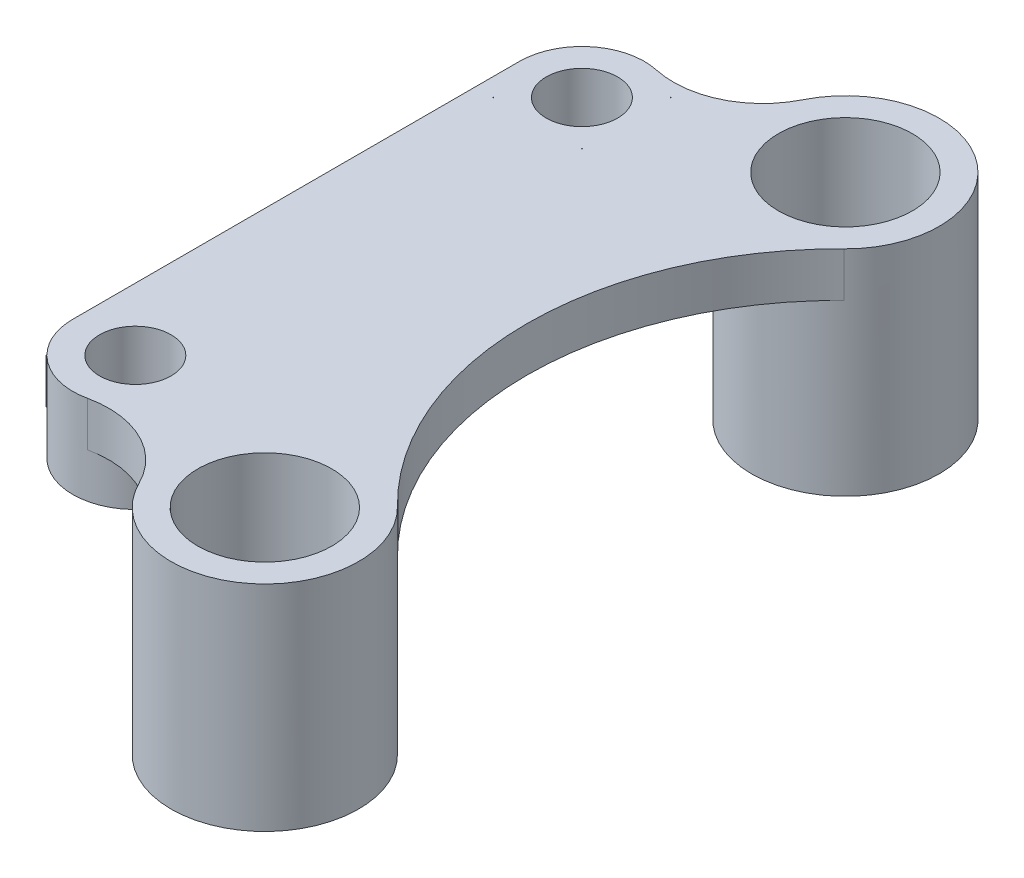
ISO-10303-21;
HEADER;
FILE_DESCRIPTION(('STEP AP214'),'2;1');
FILE_NAME('part.step','',(''),(''),'','','');
FILE_SCHEMA(('AUTOMOTIVE_DESIGN { 1 0 10303 214 1 1 1 1 }'));
ENDSEC;
DATA;
#1=APPLICATION_CONTEXT('core data for automotive mechanical design processes');
#2=APPLICATION_PROTOCOL_DEFINITION('international standard','automotive_design',2000,#1);
#3=PRODUCT_CONTEXT('',#1,'mechanical');
#4=PRODUCT('Part','Part','',(#3));
#5=PRODUCT_RELATED_PRODUCT_CATEGORY('part','',(#4));
#6=PRODUCT_DEFINITION_FORMATION('','',#4);
#7=PRODUCT_DEFINITION_CONTEXT('part definition',#1,'design');
#8=PRODUCT_DEFINITION('design','',#6,#7);
#9=PRODUCT_DEFINITION_SHAPE('','',#8);
#10=(LENGTH_UNIT() NAMED_UNIT(*) SI_UNIT(.MILLI.,.METRE.));
#11=(NAMED_UNIT(*) PLANE_ANGLE_UNIT() SI_UNIT($,.RADIAN.));
#12=(NAMED_UNIT(*) SI_UNIT($,.STERADIAN.) SOLID_ANGLE_UNIT());
#13=UNCERTAINTY_MEASURE_WITH_UNIT(LENGTH_MEASURE(1.E-05),#10,'distance_accuracy_value','');
#14=(GEOMETRIC_REPRESENTATION_CONTEXT(3) GLOBAL_UNCERTAINTY_ASSIGNED_CONTEXT((#13)) GLOBAL_UNIT_ASSIGNED_CONTEXT((#10,
#11,#12)) REPRESENTATION_CONTEXT('',''));
#15=CARTESIAN_POINT('',(0.,0.,0.));
#16=DIRECTION('',(0.,0.,1.));
#17=DIRECTION('',(1.,0.,0.));
#18=AXIS2_PLACEMENT_3D('',#15,#16,#17);
#19=CARTESIAN_POINT('',(0.,0.,0.));
#20=DIRECTION('',(0.,1.,0.));
#21=DIRECTION('',(0.,0.,1.));
#22=AXIS2_PLACEMENT_3D('',#19,#20,#21);
#23=PLANE('',#22);
#24=CARTESIAN_POINT('',(60.8433666561814,0.,0.));
#25=DIRECTION('',(0.,1.,0.));
#26=DIRECTION('',(0.,0.,1.));
#27=AXIS2_PLACEMENT_3D('',#24,#25,#26);
#28=CIRCLE('',#27,35.);
#29=CARTESIAN_POINT('',(36.3484692283495,0.,-25.));
#30=VERTEX_POINT('',#29);
#31=CARTESIAN_POINT('',(36.3484692283495,0.,25.));
#32=VERTEX_POINT('',#31);
#33=EDGE_CURVE('E338',#30,#32,#28,.T.);
#34=ORIENTED_EDGE('',*,*,#33,.T.);
#35=CARTESIAN_POINT('',(29.,0.,32.5));
#36=DIRECTION('',(0.,1.,0.));
#37=DIRECTION('',(0.,0.,1.));
#38=AXIS2_PLACEMENT_3D('',#35,#36,#37);
#39=CIRCLE('',#38,10.5);
#40=CARTESIAN_POINT('',(19.5930027499269,0.,37.1645903075315));
#41=VERTEX_POINT('',#40);
#42=EDGE_CURVE('E260',#32,#41,#39,.T.);
#43=ORIENTED_EDGE('',*,*,#42,.T.);
#44=CARTESIAN_POINT('',(10.6339577498573,0.,41.6070572670854));
#45=DIRECTION('',(0.,1.,0.));
#46=DIRECTION('',(0.,0.,1.));
#47=AXIS2_PLACEMENT_3D('',#44,#45,#46);
#48=CIRCLE('',#47,10.);
#49=CARTESIAN_POINT('',(8.49633554405888,0.,31.8382000511528));
#50=VERTEX_POINT('',#49);
#51=EDGE_CURVE('E329',#41,#50,#48,.T.);
#52=ORIENTED_EDGE('',*,*,#51,.T.);
#53=CARTESIAN_POINT('',(7.,0.,25.));
#54=DIRECTION('',(0.,1.,0.));
#55=DIRECTION('',(0.,0.,1.));
#56=AXIS2_PLACEMENT_3D('',#53,#54,#55);
#57=CIRCLE('',#56,7.);
#58=CARTESIAN_POINT('',(0.,0.,25.));
#59=VERTEX_POINT('',#58);
#60=EDGE_CURVE('E65',#50,#59,#57,.T.);
#61=ORIENTED_EDGE('',*,*,#60,.T.);
#62=DIRECTION('',(0.,0.,1.));
#63=VECTOR('',#62,1.);
#64=CARTESIAN_POINT('',(0.,0.,0.));
#65=LINE('',#64,#63);
#66=CARTESIAN_POINT('',(0.,0.,-25.));
#67=VERTEX_POINT('',#66);
#68=EDGE_CURVE('E327',#67,#59,#65,.T.);
#69=ORIENTED_EDGE('',*,*,#68,.F.);
#70=CARTESIAN_POINT('',(7.00000000000001,0.,-25.));
#71=DIRECTION('',(0.,1.,0.));
#72=DIRECTION('',(0.,0.,1.));
#73=AXIS2_PLACEMENT_3D('',#70,#71,#72);
#74=CIRCLE('',#73,7.);
#75=CARTESIAN_POINT('',(2.00000000000001,0.,-20.1010205144336));
#76=VERTEX_POINT('',#75);
#77=EDGE_CURVE('E252',#67,#76,#74,.T.);
#78=ORIENTED_EDGE('',*,*,#77,.T.);
#79=DIRECTION('',(0.,0.,-1.));
#80=VECTOR('',#79,1.);
#81=CARTESIAN_POINT('',(2.00000000000001,0.,0.));
#82=LINE('',#81,#80);
#83=CARTESIAN_POINT('',(2.00000000000001,0.,-20.));
#84=VERTEX_POINT('',#83);
#85=EDGE_CURVE('E233',#84,#76,#82,.T.);
#86=ORIENTED_EDGE('',*,*,#85,.F.);
#87=DIRECTION('',(1.,0.,0.));
#88=VECTOR('',#87,1.);
#89=CARTESIAN_POINT('',(0.,0.,-20.));
#90=LINE('',#89,#88);
#91=CARTESIAN_POINT('',(2.10102051443366,0.,-20.));
#92=VERTEX_POINT('',#91);
#93=EDGE_CURVE('E343',#84,#92,#90,.T.);
#94=ORIENTED_EDGE('',*,*,#93,.T.);
#95=CARTESIAN_POINT('',(11.8989794855664,0.,-20.));
#96=VERTEX_POINT('',#95);
#97=EDGE_CURVE('E188',#92,#96,#74,.T.);
#98=ORIENTED_EDGE('',*,*,#97,.T.);
#99=CARTESIAN_POINT('',(12.,0.,-20.));
#100=VERTEX_POINT('',#99);
#101=EDGE_CURVE('E340',#96,#100,#90,.T.);
#102=ORIENTED_EDGE('',*,*,#101,.T.);
#103=DIRECTION('',(0.,0.,-1.));
#104=VECTOR('',#103,1.);
#105=CARTESIAN_POINT('',(12.,0.,0.));
#106=LINE('',#105,#104);
#107=CARTESIAN_POINT('',(12.,0.,-20.1010205144336));
#108=VERTEX_POINT('',#107);
#109=EDGE_CURVE('E342',#100,#108,#106,.T.);
#110=ORIENTED_EDGE('',*,*,#109,.T.);
#111=CARTESIAN_POINT('',(12.,0.,-29.8989794855664));
#112=VERTEX_POINT('',#111);
#113=EDGE_CURVE('E246',#108,#112,#74,.T.);
#114=ORIENTED_EDGE('',*,*,#113,.T.);
#115=CARTESIAN_POINT('',(12.,0.,-30.));
#116=VERTEX_POINT('',#115);
#117=EDGE_CURVE('E404',#112,#116,#106,.T.);
#118=ORIENTED_EDGE('',*,*,#117,.T.);
#119=DIRECTION('',(1.,0.,0.));
#120=VECTOR('',#119,1.);
#121=CARTESIAN_POINT('',(0.,0.,-30.));
#122=LINE('',#121,#120);
#123=CARTESIAN_POINT('',(11.8989794855664,0.,-30.));
#124=VERTEX_POINT('',#123);
#125=EDGE_CURVE('E240',#124,#116,#122,.T.);
#126=ORIENTED_EDGE('',*,*,#125,.F.);
#127=CARTESIAN_POINT('',(8.49633554405889,0.,-31.8382000511528));
#128=VERTEX_POINT('',#127);
#129=EDGE_CURVE('E398',#124,#128,#74,.T.);
#130=ORIENTED_EDGE('',*,*,#129,.T.);
#131=CARTESIAN_POINT('',(10.6339577498573,0.,-41.6070572670854));
#132=DIRECTION('',(0.,1.,0.));
#133=DIRECTION('',(0.,0.,1.));
#134=AXIS2_PLACEMENT_3D('',#131,#132,#133);
#135=CIRCLE('',#134,10.);
#136=CARTESIAN_POINT('',(19.5930027499269,0.,-37.1645903075315));
#137=VERTEX_POINT('',#136);
#138=EDGE_CURVE('E332',#137,#128,#135,.F.);
#139=ORIENTED_EDGE('',*,*,#138,.F.);
#140=CARTESIAN_POINT('',(29.,0.,-32.5));
#141=DIRECTION('',(0.,1.,0.));
#142=DIRECTION('',(0.,0.,1.));
#143=AXIS2_PLACEMENT_3D('',#140,#141,#142);
#144=CIRCLE('',#143,10.5);
#145=EDGE_CURVE('E250',#137,#30,#144,.T.);
#146=ORIENTED_EDGE('',*,*,#145,.T.);
#147=EDGE_LOOP('',(#34,#43,#52,#61,#69,#78,#86,#94,#98,#102,#110,#114,#118,#126,#130,#139,#146));
#148=FACE_BOUND('',#147,.T.);
#149=ADVANCED_FACE('F53',(#148),#23,.F.);
#150=CARTESIAN_POINT('',(7.00000000000001,5.,-25.));
#151=DIRECTION('',(0.,-1.,0.));
#152=DIRECTION('',(0.,0.,-1.));
#153=AXIS2_PLACEMENT_3D('',#150,#151,#152);
#154=CYLINDRICAL_SURFACE('',#153,7.);
#155=DIRECTION('',(0.,-1.,0.));
#156=VECTOR('',#155,1.);
#157=CARTESIAN_POINT('',(2.00000000000001,5.,-20.1010205144336));
#158=LINE('',#157,#156);
#159=CARTESIAN_POINT('',(2.00000000000001,5.,-20.1010205144336));
#160=VERTEX_POINT('',#159);
#161=EDGE_CURVE('E345',#160,#76,#158,.T.);
#162=ORIENTED_EDGE('',*,*,#161,.T.);
#163=ORIENTED_EDGE('',*,*,#77,.F.);
#164=DIRECTION('',(0.,-1.,0.));
#165=VECTOR('',#164,1.);
#166=CARTESIAN_POINT('',(0.,5.,-25.));
#167=LINE('',#166,#165);
#168=CARTESIAN_POINT('',(0.,5.,-25.));
#169=VERTEX_POINT('',#168);
#170=EDGE_CURVE('E380',#169,#67,#167,.T.);
#171=ORIENTED_EDGE('',*,*,#170,.F.);
#172=CARTESIAN_POINT('',(7.00000000000001,5.,-25.));
#173=DIRECTION('',(0.,1.,0.));
#174=DIRECTION('',(0.,0.,1.));
#175=AXIS2_PLACEMENT_3D('',#172,#173,#174);
#176=CIRCLE('',#175,7.);
#177=CARTESIAN_POINT('',(8.49633554405889,5.,-31.8382000511528));
#178=VERTEX_POINT('',#177);
#179=EDGE_CURVE('E226',#178,#169,#176,.T.);
#180=ORIENTED_EDGE('',*,*,#179,.F.);
#181=DIRECTION('',(0.,-1.,0.));
#182=VECTOR('',#181,1.);
#183=CARTESIAN_POINT('',(8.49633554405889,5.,-31.8382000511528));
#184=LINE('',#183,#182);
#185=EDGE_CURVE('E351',#178,#128,#184,.T.);
#186=ORIENTED_EDGE('',*,*,#185,.T.);
#187=ORIENTED_EDGE('',*,*,#129,.F.);
#188=DIRECTION('',(0.,-1.,0.));
#189=VECTOR('',#188,1.);
#190=CARTESIAN_POINT('',(11.8989794855664,5.,-30.));
#191=LINE('',#190,#189);
#192=CARTESIAN_POINT('',(11.8989794855664,5.,-30.));
#193=VERTEX_POINT('',#192);
#194=EDGE_CURVE('E57',#193,#124,#191,.T.);
#195=ORIENTED_EDGE('',*,*,#194,.F.);
#196=CARTESIAN_POINT('',(7.00000000000001,5.,-25.));
#197=DIRECTION('',(0.,1.,0.));
#198=DIRECTION('',(0.,0.,1.));
#199=AXIS2_PLACEMENT_3D('',#196,#197,#198);
#200=CIRCLE('',#199,7.);
#201=CARTESIAN_POINT('',(12.,5.,-29.8989794855664));
#202=VERTEX_POINT('',#201);
#203=EDGE_CURVE('E180',#202,#193,#200,.T.);
#204=ORIENTED_EDGE('',*,*,#203,.F.);
#205=DIRECTION('',(0.,-1.,0.));
#206=VECTOR('',#205,1.);
#207=CARTESIAN_POINT('',(12.,5.,-29.8989794855664));
#208=LINE('',#207,#206);
#209=EDGE_CURVE('E385',#202,#112,#208,.T.);
#210=ORIENTED_EDGE('',*,*,#209,.T.);
#211=ORIENTED_EDGE('',*,*,#113,.F.);
#212=DIRECTION('',(0.,-1.,0.));
#213=VECTOR('',#212,1.);
#214=CARTESIAN_POINT('',(12.,5.,-20.1010205144336));
#215=LINE('',#214,#213);
#216=CARTESIAN_POINT('',(12.,5.,-20.1010205144336));
#217=VERTEX_POINT('',#216);
#218=EDGE_CURVE('E350',#217,#108,#215,.T.);
#219=ORIENTED_EDGE('',*,*,#218,.F.);
#220=CARTESIAN_POINT('',(11.8989794855664,5.,-20.));
#221=VERTEX_POINT('',#220);
#222=EDGE_CURVE('E179',#221,#217,#200,.T.);
#223=ORIENTED_EDGE('',*,*,#222,.F.);
#224=DIRECTION('',(0.,-1.,0.));
#225=VECTOR('',#224,1.);
#226=CARTESIAN_POINT('',(11.8989794855664,5.,-20.));
#227=LINE('',#226,#225);
#228=EDGE_CURVE('E347',#221,#96,#227,.T.);
#229=ORIENTED_EDGE('',*,*,#228,.T.);
#230=ORIENTED_EDGE('',*,*,#97,.F.);
#231=DIRECTION('',(0.,-1.,0.));
#232=VECTOR('',#231,1.);
#233=CARTESIAN_POINT('',(2.10102051443366,5.,-20.));
#234=LINE('',#233,#232);
#235=CARTESIAN_POINT('',(2.10102051443366,5.,-20.));
#236=VERTEX_POINT('',#235);
#237=EDGE_CURVE('E63',#236,#92,#234,.T.);
#238=ORIENTED_EDGE('',*,*,#237,.F.);
#239=EDGE_CURVE('E169',#160,#236,#200,.T.);
#240=ORIENTED_EDGE('',*,*,#239,.F.);
#241=EDGE_LOOP('',(#162,#163,#171,#180,#186,#187,#195,#204,#210,#211,#219,#223,#229,#230,#238,#240));
#242=FACE_BOUND('',#241,.T.);
#243=CARTESIAN_POINT('',(7.00000000000001,-5.,-25.));
#244=DIRECTION('',(0.,1.,0.));
#245=DIRECTION('',(0.,0.,1.));
#246=AXIS2_PLACEMENT_3D('',#243,#244,#245);
#247=CIRCLE('',#246,7.);
#248=CARTESIAN_POINT('',(7.00000000000001,-5.,-18.));
#249=VERTEX_POINT('',#248);
#250=EDGE_CURVE('E247',#249,#249,#247,.T.);
#251=ORIENTED_EDGE('',*,*,#250,.T.);
#252=EDGE_LOOP('',(#251));
#253=FACE_BOUND('',#252,.T.);
#254=ADVANCED_FACE('F183',(#242,#253),#154,.T.);
#255=CARTESIAN_POINT('',(0.,5.,-20.));
#256=DIRECTION('',(0.,0.,-1.));
#257=DIRECTION('',(-1.,0.,0.));
#258=AXIS2_PLACEMENT_3D('',#255,#256,#257);
#259=PLANE('',#258);
#260=ORIENTED_EDGE('',*,*,#93,.F.);
#261=DIRECTION('',(0.,-1.,0.));
#262=VECTOR('',#261,1.);
#263=CARTESIAN_POINT('',(2.00000000000001,5.,-20.));
#264=LINE('',#263,#262);
#265=CARTESIAN_POINT('',(2.00000000000001,5.,-20.));
#266=VERTEX_POINT('',#265);
#267=EDGE_CURVE('E110',#266,#84,#264,.T.);
#268=ORIENTED_EDGE('',*,*,#267,.F.);
#269=DIRECTION('',(1.,0.,0.));
#270=VECTOR('',#269,1.);
#271=CARTESIAN_POINT('',(0.,5.,-20.));
#272=LINE('',#271,#270);
#273=EDGE_CURVE('E174',#266,#236,#272,.T.);
#274=ORIENTED_EDGE('',*,*,#273,.T.);
#275=ORIENTED_EDGE('',*,*,#237,.T.);
#276=EDGE_LOOP('',(#260,#268,#274,#275));
#277=FACE_BOUND('',#276,.T.);
#278=ADVANCED_FACE('F193',(#277),#259,.T.);
#279=ORIENTED_EDGE('',*,*,#101,.F.);
#280=ORIENTED_EDGE('',*,*,#228,.F.);
#281=CARTESIAN_POINT('',(12.,5.,-20.));
#282=VERTEX_POINT('',#281);
#283=EDGE_CURVE('E195',#221,#282,#272,.T.);
#284=ORIENTED_EDGE('',*,*,#283,.T.);
#285=DIRECTION('',(0.,-1.,0.));
#286=VECTOR('',#285,1.);
#287=CARTESIAN_POINT('',(12.,5.,-20.));
#288=LINE('',#287,#286);
#289=EDGE_CURVE('E104',#282,#100,#288,.T.);
#290=ORIENTED_EDGE('',*,*,#289,.T.);
#291=EDGE_LOOP('',(#279,#280,#284,#290));
#292=FACE_BOUND('',#291,.T.);
#293=ADVANCED_FACE('F462',(#292),#259,.T.);
#294=CARTESIAN_POINT('',(10.6339577498573,5.,-41.6070572670854));
#295=DIRECTION('',(0.,-1.,0.));
#296=DIRECTION('',(0.,0.,-1.));
#297=AXIS2_PLACEMENT_3D('',#294,#295,#296);
#298=CYLINDRICAL_SURFACE('',#297,10.);
#299=ORIENTED_EDGE('',*,*,#138,.T.);
#300=ORIENTED_EDGE('',*,*,#185,.F.);
#301=CARTESIAN_POINT('',(10.6339577498573,5.,-41.6070572670854));
#302=DIRECTION('',(0.,1.,0.));
#303=DIRECTION('',(0.,0.,1.));
#304=AXIS2_PLACEMENT_3D('',#301,#302,#303);
#305=CIRCLE('',#304,10.);
#306=CARTESIAN_POINT('',(19.5930027499269,5.,-37.1645903075315));
#307=VERTEX_POINT('',#306);
#308=EDGE_CURVE('E228',#307,#178,#305,.F.);
#309=ORIENTED_EDGE('',*,*,#308,.F.);
#310=DIRECTION('',(0.,-1.,0.));
#311=VECTOR('',#310,1.);
#312=CARTESIAN_POINT('',(19.5930027499269,5.,-37.1645903075315));
#313=LINE('',#312,#311);
#314=EDGE_CURVE('E355',#307,#137,#313,.T.);
#315=ORIENTED_EDGE('',*,*,#314,.T.);
#316=EDGE_LOOP('',(#299,#300,#309,#315));
#317=FACE_BOUND('',#316,.T.);
#318=ADVANCED_FACE('F410',(#317),#298,.F.);
#319=CARTESIAN_POINT('',(0.,5.,0.));
#320=DIRECTION('',(1.,0.,0.));
#321=DIRECTION('',(0.,0.,-1.));
#322=AXIS2_PLACEMENT_3D('',#319,#320,#321);
#323=PLANE('',#322);
#324=ORIENTED_EDGE('',*,*,#68,.T.);
#325=DIRECTION('',(0.,-1.,0.));
#326=VECTOR('',#325,1.);
#327=CARTESIAN_POINT('',(0.,5.,25.));
#328=LINE('',#327,#326);
#329=CARTESIAN_POINT('',(0.,5.,25.));
#330=VERTEX_POINT('',#329);
#331=EDGE_CURVE('E377',#330,#59,#328,.T.);
#332=ORIENTED_EDGE('',*,*,#331,.F.);
#333=DIRECTION('',(0.,0.,1.));
#334=VECTOR('',#333,1.);
#335=CARTESIAN_POINT('',(0.,5.,0.));
#336=LINE('',#335,#334);
#337=EDGE_CURVE('E224',#169,#330,#336,.T.);
#338=ORIENTED_EDGE('',*,*,#337,.F.);
#339=ORIENTED_EDGE('',*,*,#170,.T.);
#340=EDGE_LOOP('',(#324,#332,#338,#339));
#341=FACE_BOUND('',#340,.T.);
#342=ADVANCED_FACE('F440',(#341),#323,.F.);
#343=CARTESIAN_POINT('',(2.,5.,0.));
#344=DIRECTION('',(1.,0.,0.));
#345=DIRECTION('',(0.,0.,-1.));
#346=AXIS2_PLACEMENT_3D('',#343,#344,#345);
#347=PLANE('',#346);
#348=DIRECTION('',(0.,0.,1.));
#349=VECTOR('',#348,1.);
#350=CARTESIAN_POINT('',(2.,0.,0.));
#351=LINE('',#350,#349);
#352=CARTESIAN_POINT('',(2.00000000000001,0.,29.8989794855664));
#353=VERTEX_POINT('',#352);
#354=CARTESIAN_POINT('',(2.,0.,30.));
#355=VERTEX_POINT('',#354);
#356=EDGE_CURVE('E318',#353,#355,#351,.T.);
#357=ORIENTED_EDGE('',*,*,#356,.T.);
#358=DIRECTION('',(0.,-1.,0.));
#359=VECTOR('',#358,1.);
#360=CARTESIAN_POINT('',(2.,5.,30.));
#361=LINE('',#360,#359);
#362=CARTESIAN_POINT('',(2.,5.,30.));
#363=VERTEX_POINT('',#362);
#364=EDGE_CURVE('E373',#363,#355,#361,.T.);
#365=ORIENTED_EDGE('',*,*,#364,.F.);
#366=DIRECTION('',(0.,0.,1.));
#367=VECTOR('',#366,1.);
#368=CARTESIAN_POINT('',(2.,5.,0.));
#369=LINE('',#368,#367);
#370=CARTESIAN_POINT('',(2.00000000000001,5.,29.8989794855664));
#371=VERTEX_POINT('',#370);
#372=EDGE_CURVE('E220',#371,#363,#369,.T.);
#373=ORIENTED_EDGE('',*,*,#372,.F.);
#374=DIRECTION('',(0.,-1.,0.));
#375=VECTOR('',#374,1.);
#376=CARTESIAN_POINT('',(2.00000000000001,5.,29.8989794855664));
#377=LINE('',#376,#375);
#378=EDGE_CURVE('E375',#371,#353,#377,.T.);
#379=ORIENTED_EDGE('',*,*,#378,.T.);
#380=EDGE_LOOP('',(#357,#365,#373,#379));
#381=FACE_BOUND('',#380,.T.);
#382=ADVANCED_FACE('F482',(#381),#347,.F.);
#383=CARTESIAN_POINT('',(0.,5.,30.));
#384=DIRECTION('',(0.,0.,-1.));
#385=DIRECTION('',(-1.,0.,0.));
#386=AXIS2_PLACEMENT_3D('',#383,#384,#385);
#387=PLANE('',#386);
#388=DIRECTION('',(1.,0.,0.));
#389=VECTOR('',#388,1.);
#390=CARTESIAN_POINT('',(0.,0.,30.));
#391=LINE('',#390,#389);
#392=CARTESIAN_POINT('',(2.10102051443365,0.,30.));
#393=VERTEX_POINT('',#392);
#394=EDGE_CURVE('E321',#355,#393,#391,.T.);
#395=ORIENTED_EDGE('',*,*,#394,.T.);
#396=DIRECTION('',(0.,-1.,0.));
#397=VECTOR('',#396,1.);
#398=CARTESIAN_POINT('',(2.10102051443365,5.,30.));
#399=LINE('',#398,#397);
#400=CARTESIAN_POINT('',(2.10102051443365,5.,30.));
#401=VERTEX_POINT('',#400);
#402=EDGE_CURVE('E370',#401,#393,#399,.T.);
#403=ORIENTED_EDGE('',*,*,#402,.F.);
#404=DIRECTION('',(1.,0.,0.));
#405=VECTOR('',#404,1.);
#406=CARTESIAN_POINT('',(0.,5.,30.));
#407=LINE('',#406,#405);
#408=EDGE_CURVE('E218',#363,#401,#407,.T.);
#409=ORIENTED_EDGE('',*,*,#408,.F.);
#410=ORIENTED_EDGE('',*,*,#364,.T.);
#411=EDGE_LOOP('',(#395,#403,#409,#410));
#412=FACE_BOUND('',#411,.T.);
#413=ADVANCED_FACE('F479',(#412),#387,.F.);
#414=CARTESIAN_POINT('',(7.,5.,25.));
#415=DIRECTION('',(0.,-1.,0.));
#416=DIRECTION('',(0.,0.,-1.));
#417=AXIS2_PLACEMENT_3D('',#414,#415,#416);
#418=CYLINDRICAL_SURFACE('',#417,7.);
#419=ORIENTED_EDGE('',*,*,#402,.T.);
#420=EDGE_CURVE('E12',#353,#393,#57,.T.);
#421=ORIENTED_EDGE('',*,*,#420,.F.);
#422=ORIENTED_EDGE('',*,*,#378,.F.);
#423=CARTESIAN_POINT('',(7.,5.,25.));
#424=DIRECTION('',(0.,1.,0.));
#425=DIRECTION('',(0.,0.,1.));
#426=AXIS2_PLACEMENT_3D('',#423,#424,#425);
#427=CIRCLE('',#426,7.);
#428=EDGE_CURVE('E222',#330,#371,#427,.T.);
#429=ORIENTED_EDGE('',*,*,#428,.F.);
#430=ORIENTED_EDGE('',*,*,#331,.T.);
#431=ORIENTED_EDGE('',*,*,#60,.F.);
#432=DIRECTION('',(0.,-1.,0.));
#433=VECTOR('',#432,1.);
#434=CARTESIAN_POINT('',(8.49633554405888,5.,31.8382000511528));
#435=LINE('',#434,#433);
#436=CARTESIAN_POINT('',(8.49633554405888,5.,31.8382000511528));
#437=VERTEX_POINT('',#436);
#438=EDGE_CURVE('E367',#437,#50,#435,.T.);
#439=ORIENTED_EDGE('',*,*,#438,.F.);
#440=CARTESIAN_POINT('',(7.,5.,25.));
#441=DIRECTION('',(0.,1.,0.));
#442=DIRECTION('',(0.,0.,1.));
#443=AXIS2_PLACEMENT_3D('',#440,#441,#442);
#444=CIRCLE('',#443,7.);
#445=EDGE_CURVE('E216',#401,#437,#444,.T.);
#446=ORIENTED_EDGE('',*,*,#445,.F.);
#447=EDGE_LOOP('',(#419,#421,#422,#429,#430,#431,#439,#446));
#448=FACE_BOUND('',#447,.T.);
#449=CARTESIAN_POINT('',(7.,-5.,25.));
#450=DIRECTION('',(0.,1.,0.));
#451=DIRECTION('',(0.,0.,1.));
#452=AXIS2_PLACEMENT_3D('',#449,#450,#451);
#453=CIRCLE('',#452,7.);
#454=CARTESIAN_POINT('',(7.,-5.,32.));
#455=VERTEX_POINT('',#454);
#456=EDGE_CURVE('E236',#455,#455,#453,.T.);
#457=ORIENTED_EDGE('',*,*,#456,.T.);
#458=EDGE_LOOP('',(#457));
#459=FACE_BOUND('',#458,.T.);
#460=ADVANCED_FACE('F444',(#448,#459),#418,.T.);
#461=CARTESIAN_POINT('',(10.6339577498573,5.,41.6070572670854));
#462=DIRECTION('',(0.,-1.,0.));
#463=DIRECTION('',(0.,0.,-1.));
#464=AXIS2_PLACEMENT_3D('',#461,#462,#463);
#465=CYLINDRICAL_SURFACE('',#464,10.);
#466=ORIENTED_EDGE('',*,*,#51,.F.);
#467=DIRECTION('',(0.,-1.,0.));
#468=VECTOR('',#467,1.);
#469=CARTESIAN_POINT('',(19.5930027499269,5.,37.1645903075315));
#470=LINE('',#469,#468);
#471=CARTESIAN_POINT('',(19.5930027499269,5.,37.1645903075315));
#472=VERTEX_POINT('',#471);
#473=EDGE_CURVE('E364',#472,#41,#470,.T.);
#474=ORIENTED_EDGE('',*,*,#473,.F.);
#475=CARTESIAN_POINT('',(10.6339577498573,5.,41.6070572670854));
#476=DIRECTION('',(0.,1.,0.));
#477=DIRECTION('',(0.,0.,1.));
#478=AXIS2_PLACEMENT_3D('',#475,#476,#477);
#479=CIRCLE('',#478,10.);
#480=EDGE_CURVE('E213',#472,#437,#479,.T.);
#481=ORIENTED_EDGE('',*,*,#480,.T.);
#482=ORIENTED_EDGE('',*,*,#438,.T.);
#483=EDGE_LOOP('',(#466,#474,#481,#482));
#484=FACE_BOUND('',#483,.T.);
#485=ADVANCED_FACE('F472',(#484),#465,.F.);
#486=CARTESIAN_POINT('',(29.,5.,32.5));
#487=DIRECTION('',(0.,-1.,0.));
#488=DIRECTION('',(0.,0.,-1.));
#489=AXIS2_PLACEMENT_3D('',#486,#487,#488);
#490=CYLINDRICAL_SURFACE('',#489,10.5);
#491=ORIENTED_EDGE('',*,*,#473,.T.);
#492=ORIENTED_EDGE('',*,*,#42,.F.);
#493=DIRECTION('',(0.,-1.,0.));
#494=VECTOR('',#493,1.);
#495=CARTESIAN_POINT('',(36.3484692283495,5.,25.));
#496=LINE('',#495,#494);
#497=CARTESIAN_POINT('',(36.3484692283495,5.,25.));
#498=VERTEX_POINT('',#497);
#499=EDGE_CURVE('E361',#498,#32,#496,.T.);
#500=ORIENTED_EDGE('',*,*,#499,.F.);
#501=CARTESIAN_POINT('',(29.,5.,32.5));
#502=DIRECTION('',(0.,1.,0.));
#503=DIRECTION('',(0.,0.,1.));
#504=AXIS2_PLACEMENT_3D('',#501,#502,#503);
#505=CIRCLE('',#504,10.5);
#506=EDGE_CURVE('E209',#472,#498,#505,.T.);
#507=ORIENTED_EDGE('',*,*,#506,.F.);
#508=EDGE_LOOP('',(#491,#492,#500,#507));
#509=FACE_BOUND('',#508,.T.);
#510=CARTESIAN_POINT('',(29.,-19.,32.5));
#511=DIRECTION('',(0.,1.,0.));
#512=DIRECTION('',(0.,0.,1.));
#513=AXIS2_PLACEMENT_3D('',#510,#511,#512);
#514=CIRCLE('',#513,10.5);
#515=CARTESIAN_POINT('',(29.,-19.,43.));
#516=VERTEX_POINT('',#515);
#517=EDGE_CURVE('E263',#516,#516,#514,.T.);
#518=ORIENTED_EDGE('',*,*,#517,.T.);
#519=EDGE_LOOP('',(#518));
#520=FACE_BOUND('',#519,.T.);
#521=ADVANCED_FACE('F468',(#509,#520),#490,.T.);
#522=CARTESIAN_POINT('',(60.8433666561814,5.,0.));
#523=DIRECTION('',(0.,-1.,0.));
#524=DIRECTION('',(0.,0.,-1.));
#525=AXIS2_PLACEMENT_3D('',#522,#523,#524);
#526=CYLINDRICAL_SURFACE('',#525,35.);
#527=ORIENTED_EDGE('',*,*,#33,.F.);
#528=DIRECTION('',(0.,-1.,0.));
#529=VECTOR('',#528,1.);
#530=CARTESIAN_POINT('',(36.3484692283495,5.,-25.));
#531=LINE('',#530,#529);
#532=CARTESIAN_POINT('',(36.3484692283495,5.,-25.));
#533=VERTEX_POINT('',#532);
#534=EDGE_CURVE('E358',#533,#30,#531,.T.);
#535=ORIENTED_EDGE('',*,*,#534,.F.);
#536=CARTESIAN_POINT('',(60.8433666561814,5.,0.));
#537=DIRECTION('',(0.,1.,0.));
#538=DIRECTION('',(0.,0.,1.));
#539=AXIS2_PLACEMENT_3D('',#536,#537,#538);
#540=CIRCLE('',#539,35.);
#541=EDGE_CURVE('E202',#533,#498,#540,.T.);
#542=ORIENTED_EDGE('',*,*,#541,.T.);
#543=ORIENTED_EDGE('',*,*,#499,.T.);
#544=EDGE_LOOP('',(#527,#535,#542,#543));
#545=FACE_BOUND('',#544,.T.);
#546=ADVANCED_FACE('F465',(#545),#526,.F.);
#547=CARTESIAN_POINT('',(0.,5.,-30.));
#548=DIRECTION('',(0.,0.,-1.));
#549=DIRECTION('',(-1.,0.,0.));
#550=AXIS2_PLACEMENT_3D('',#547,#548,#549);
#551=PLANE('',#550);
#552=ORIENTED_EDGE('',*,*,#125,.T.);
#553=DIRECTION('',(0.,-1.,0.));
#554=VECTOR('',#553,1.);
#555=CARTESIAN_POINT('',(12.,5.,-30.));
#556=LINE('',#555,#554);
#557=CARTESIAN_POINT('',(12.,5.,-30.));
#558=VERTEX_POINT('',#557);
#559=EDGE_CURVE('E387',#558,#116,#556,.T.);
#560=ORIENTED_EDGE('',*,*,#559,.F.);
#561=DIRECTION('',(1.,0.,0.));
#562=VECTOR('',#561,1.);
#563=CARTESIAN_POINT('',(0.,5.,-30.));
#564=LINE('',#563,#562);
#565=EDGE_CURVE('E119',#193,#558,#564,.T.);
#566=ORIENTED_EDGE('',*,*,#565,.F.);
#567=ORIENTED_EDGE('',*,*,#194,.T.);
#568=EDGE_LOOP('',(#552,#560,#566,#567));
#569=FACE_BOUND('',#568,.T.);
#570=ADVANCED_FACE('F55',(#569),#551,.F.);
#571=CARTESIAN_POINT('',(29.,5.,-32.5));
#572=DIRECTION('',(0.,-1.,0.));
#573=DIRECTION('',(0.,0.,-1.));
#574=AXIS2_PLACEMENT_3D('',#571,#572,#573);
#575=CYLINDRICAL_SURFACE('',#574,7.49999999999999);
#576=CARTESIAN_POINT('',(29.,5.,-32.5));
#577=DIRECTION('',(0.,1.,0.));
#578=DIRECTION('',(0.,0.,1.));
#579=AXIS2_PLACEMENT_3D('',#576,#577,#578);
#580=CIRCLE('',#579,7.49999999999999);
#581=CARTESIAN_POINT('',(29.,5.,-25.));
#582=VERTEX_POINT('',#581);
#583=EDGE_CURVE('E787',#582,#582,#580,.T.);
#584=ORIENTED_EDGE('',*,*,#583,.T.);
#585=EDGE_LOOP('',(#584));
#586=FACE_BOUND('',#585,.T.);
#587=CARTESIAN_POINT('',(29.,-19.,-32.5));
#588=DIRECTION('',(0.,1.,0.));
#589=DIRECTION('',(0.,0.,1.));
#590=AXIS2_PLACEMENT_3D('',#587,#588,#589);
#591=CIRCLE('',#590,7.49999999999999);
#592=CARTESIAN_POINT('',(29.,-19.,-25.));
#593=VERTEX_POINT('',#592);
#594=EDGE_CURVE('E257',#593,#593,#591,.T.);
#595=ORIENTED_EDGE('',*,*,#594,.F.);
#596=EDGE_LOOP('',(#595));
#597=FACE_BOUND('',#596,.T.);
#598=ADVANCED_FACE('F276',(#586,#597),#575,.F.);
#599=CARTESIAN_POINT('',(29.,5.,32.5));
#600=DIRECTION('',(0.,-1.,0.));
#601=DIRECTION('',(0.,0.,-1.));
#602=AXIS2_PLACEMENT_3D('',#599,#600,#601);
#603=CYLINDRICAL_SURFACE('',#602,7.49999999999998);
#604=CARTESIAN_POINT('',(29.,5.,32.5));
#605=DIRECTION('',(0.,1.,0.));
#606=DIRECTION('',(0.,0.,1.));
#607=AXIS2_PLACEMENT_3D('',#604,#605,#606);
#608=CIRCLE('',#607,7.49999999999998);
#609=CARTESIAN_POINT('',(29.,5.,40.));
#610=VERTEX_POINT('',#609);
#611=EDGE_CURVE('E789',#610,#610,#608,.T.);
#612=ORIENTED_EDGE('',*,*,#611,.T.);
#613=EDGE_LOOP('',(#612));
#614=FACE_BOUND('',#613,.T.);
#615=CARTESIAN_POINT('',(29.,-19.,32.5));
#616=DIRECTION('',(0.,1.,0.));
#617=DIRECTION('',(0.,0.,1.));
#618=AXIS2_PLACEMENT_3D('',#615,#616,#617);
#619=CIRCLE('',#618,7.49999999999998);
#620=CARTESIAN_POINT('',(29.,-19.,40.));
#621=VERTEX_POINT('',#620);
#622=EDGE_CURVE('E266',#621,#621,#619,.T.);
#623=ORIENTED_EDGE('',*,*,#622,.F.);
#624=EDGE_LOOP('',(#623));
#625=FACE_BOUND('',#624,.T.);
#626=ADVANCED_FACE('F273',(#614,#625),#603,.F.);
#627=CARTESIAN_POINT('',(7.,5.,25.));
#628=DIRECTION('',(0.,-1.,0.));
#629=DIRECTION('',(0.,0.,-1.));
#630=AXIS2_PLACEMENT_3D('',#627,#628,#629);
#631=CYLINDRICAL_SURFACE('',#630,4.);
#632=CARTESIAN_POINT('',(7.,5.,25.));
#633=DIRECTION('',(0.,1.,0.));
#634=DIRECTION('',(0.,0.,1.));
#635=AXIS2_PLACEMENT_3D('',#632,#633,#634);
#636=CIRCLE('',#635,4.);
#637=CARTESIAN_POINT('',(7.,5.,29.));
#638=VERTEX_POINT('',#637);
#639=EDGE_CURVE('E196',#638,#638,#636,.T.);
#640=ORIENTED_EDGE('',*,*,#639,.T.);
#641=EDGE_LOOP('',(#640));
#642=FACE_BOUND('',#641,.T.);
#643=CARTESIAN_POINT('',(7.,-5.,25.));
#644=DIRECTION('',(0.,1.,0.));
#645=DIRECTION('',(0.,0.,1.));
#646=AXIS2_PLACEMENT_3D('',#643,#644,#645);
#647=CIRCLE('',#646,4.);
#648=CARTESIAN_POINT('',(7.,-5.,29.));
#649=VERTEX_POINT('',#648);
#650=EDGE_CURVE('E237',#649,#649,#647,.T.);
#651=ORIENTED_EDGE('',*,*,#650,.F.);
#652=EDGE_LOOP('',(#651));
#653=FACE_BOUND('',#652,.T.);
#654=ADVANCED_FACE('F275',(#642,#653),#631,.F.);
#655=CARTESIAN_POINT('',(2.00000000000001,5.,0.));
#656=DIRECTION('',(-1.,0.,0.));
#657=DIRECTION('',(0.,0.,1.));
#658=AXIS2_PLACEMENT_3D('',#655,#656,#657);
#659=PLANE('',#658);
#660=ORIENTED_EDGE('',*,*,#85,.T.);
#661=ORIENTED_EDGE('',*,*,#161,.F.);
#662=DIRECTION('',(0.,0.,-1.));
#663=VECTOR('',#662,1.);
#664=CARTESIAN_POINT('',(2.00000000000001,5.,0.));
#665=LINE('',#664,#663);
#666=EDGE_CURVE('E73',#266,#160,#665,.T.);
#667=ORIENTED_EDGE('',*,*,#666,.F.);
#668=ORIENTED_EDGE('',*,*,#267,.T.);
#669=EDGE_LOOP('',(#660,#661,#667,#668));
#670=FACE_BOUND('',#669,.T.);
#671=ADVANCED_FACE('F284',(#670),#659,.F.);
#672=CARTESIAN_POINT('',(12.,5.,0.));
#673=DIRECTION('',(-1.,0.,0.));
#674=DIRECTION('',(0.,0.,1.));
#675=AXIS2_PLACEMENT_3D('',#672,#673,#674);
#676=PLANE('',#675);
#677=ORIENTED_EDGE('',*,*,#109,.F.);
#678=ORIENTED_EDGE('',*,*,#289,.F.);
#679=DIRECTION('',(0.,0.,-1.));
#680=VECTOR('',#679,1.);
#681=CARTESIAN_POINT('',(12.,5.,0.));
#682=LINE('',#681,#680);
#683=EDGE_CURVE('E177',#282,#217,#682,.T.);
#684=ORIENTED_EDGE('',*,*,#683,.T.);
#685=ORIENTED_EDGE('',*,*,#218,.T.);
#686=EDGE_LOOP('',(#677,#678,#684,#685));
#687=FACE_BOUND('',#686,.T.);
#688=ADVANCED_FACE('F451',(#687),#676,.T.);
#689=CARTESIAN_POINT('',(29.,5.,-32.5));
#690=DIRECTION('',(0.,-1.,0.));
#691=DIRECTION('',(0.,0.,-1.));
#692=AXIS2_PLACEMENT_3D('',#689,#690,#691);
#693=CYLINDRICAL_SURFACE('',#692,10.5);
#694=ORIENTED_EDGE('',*,*,#534,.T.);
#695=ORIENTED_EDGE('',*,*,#145,.F.);
#696=ORIENTED_EDGE('',*,*,#314,.F.);
#697=CARTESIAN_POINT('',(29.,5.,-32.5));
#698=DIRECTION('',(0.,1.,0.));
#699=DIRECTION('',(0.,0.,1.));
#700=AXIS2_PLACEMENT_3D('',#697,#698,#699);
#701=CIRCLE('',#700,10.5);
#702=EDGE_CURVE('E199',#533,#307,#701,.T.);
#703=ORIENTED_EDGE('',*,*,#702,.F.);
#704=EDGE_LOOP('',(#694,#695,#696,#703));
#705=FACE_BOUND('',#704,.T.);
#706=CARTESIAN_POINT('',(29.,-19.,-32.5));
#707=DIRECTION('',(0.,1.,0.));
#708=DIRECTION('',(0.,0.,1.));
#709=AXIS2_PLACEMENT_3D('',#706,#707,#708);
#710=CIRCLE('',#709,10.5);
#711=CARTESIAN_POINT('',(29.,-19.,-22.));
#712=VERTEX_POINT('',#711);
#713=EDGE_CURVE('E254',#712,#712,#710,.T.);
#714=ORIENTED_EDGE('',*,*,#713,.T.);
#715=EDGE_LOOP('',(#714));
#716=FACE_BOUND('',#715,.T.);
#717=ADVANCED_FACE('F456',(#705,#716),#693,.T.);
#718=ORIENTED_EDGE('',*,*,#117,.F.);
#719=ORIENTED_EDGE('',*,*,#209,.F.);
#720=EDGE_CURVE('E230',#202,#558,#682,.T.);
#721=ORIENTED_EDGE('',*,*,#720,.T.);
#722=ORIENTED_EDGE('',*,*,#559,.T.);
#723=EDGE_LOOP('',(#718,#719,#721,#722));
#724=FACE_BOUND('',#723,.T.);
#725=ADVANCED_FACE('F459',(#724),#676,.T.);
#726=CARTESIAN_POINT('',(7.00000000000001,5.,-25.));
#727=DIRECTION('',(0.,-1.,0.));
#728=DIRECTION('',(0.,0.,-1.));
#729=AXIS2_PLACEMENT_3D('',#726,#727,#728);
#730=CYLINDRICAL_SURFACE('',#729,4.);
#731=CARTESIAN_POINT('',(7.00000000000001,5.,-25.));
#732=DIRECTION('',(0.,1.,0.));
#733=DIRECTION('',(0.,0.,1.));
#734=AXIS2_PLACEMENT_3D('',#731,#732,#733);
#735=CIRCLE('',#734,4.);
#736=CARTESIAN_POINT('',(7.00000000000001,5.,-21.));
#737=VERTEX_POINT('',#736);
#738=EDGE_CURVE('E388',#737,#737,#735,.T.);
#739=ORIENTED_EDGE('',*,*,#738,.T.);
#740=EDGE_LOOP('',(#739));
#741=FACE_BOUND('',#740,.T.);
#742=CARTESIAN_POINT('',(7.00000000000001,-5.,-25.));
#743=DIRECTION('',(0.,1.,0.));
#744=DIRECTION('',(0.,0.,1.));
#745=AXIS2_PLACEMENT_3D('',#742,#743,#744);
#746=CIRCLE('',#745,4.);
#747=CARTESIAN_POINT('',(7.00000000000001,-5.,-21.));
#748=VERTEX_POINT('',#747);
#749=EDGE_CURVE('E243',#748,#748,#746,.T.);
#750=ORIENTED_EDGE('',*,*,#749,.F.);
#751=EDGE_LOOP('',(#750));
#752=FACE_BOUND('',#751,.T.);
#753=ADVANCED_FACE('F314',(#741,#752),#730,.F.);
#754=CARTESIAN_POINT('',(0.,5.,0.));
#755=DIRECTION('',(0.,1.,0.));
#756=DIRECTION('',(0.,0.,1.));
#757=AXIS2_PLACEMENT_3D('',#754,#755,#756);
#758=PLANE('',#757);
#759=ORIENTED_EDGE('',*,*,#480,.F.);
#760=ORIENTED_EDGE('',*,*,#506,.T.);
#761=ORIENTED_EDGE('',*,*,#541,.F.);
#762=ORIENTED_EDGE('',*,*,#702,.T.);
#763=ORIENTED_EDGE('',*,*,#308,.T.);
#764=ORIENTED_EDGE('',*,*,#179,.T.);
#765=ORIENTED_EDGE('',*,*,#337,.T.);
#766=ORIENTED_EDGE('',*,*,#428,.T.);
#767=ORIENTED_EDGE('',*,*,#372,.T.);
#768=ORIENTED_EDGE('',*,*,#408,.T.);
#769=ORIENTED_EDGE('',*,*,#445,.T.);
#770=EDGE_LOOP('',(#759,#760,#761,#762,#763,#764,#765,#766,#767,#768,#769));
#771=FACE_BOUND('',#770,.T.);
#772=ORIENTED_EDGE('',*,*,#203,.T.);
#773=ORIENTED_EDGE('',*,*,#565,.T.);
#774=ORIENTED_EDGE('',*,*,#720,.F.);
#775=EDGE_LOOP('',(#772,#773,#774));
#776=FACE_BOUND('',#775,.T.);
#777=ORIENTED_EDGE('',*,*,#283,.F.);
#778=ORIENTED_EDGE('',*,*,#222,.T.);
#779=ORIENTED_EDGE('',*,*,#683,.F.);
#780=EDGE_LOOP('',(#777,#778,#779));
#781=FACE_BOUND('',#780,.T.);
#782=ORIENTED_EDGE('',*,*,#239,.T.);
#783=ORIENTED_EDGE('',*,*,#273,.F.);
#784=ORIENTED_EDGE('',*,*,#666,.T.);
#785=EDGE_LOOP('',(#782,#783,#784));
#786=FACE_BOUND('',#785,.T.);
#787=ORIENTED_EDGE('',*,*,#639,.F.);
#788=EDGE_LOOP('',(#787));
#789=FACE_BOUND('',#788,.T.);
#790=ORIENTED_EDGE('',*,*,#738,.F.);
#791=EDGE_LOOP('',(#790));
#792=FACE_BOUND('',#791,.T.);
#793=ORIENTED_EDGE('',*,*,#583,.F.);
#794=EDGE_LOOP('',(#793));
#795=FACE_BOUND('',#794,.T.);
#796=ORIENTED_EDGE('',*,*,#611,.F.);
#797=EDGE_LOOP('',(#796));
#798=FACE_BOUND('',#797,.T.);
#799=ADVANCED_FACE('F171',(#771,#776,#781,#786,#789,#792,#795,#798),#758,.T.);
#800=ORIENTED_EDGE('',*,*,#356,.F.);
#801=ORIENTED_EDGE('',*,*,#420,.T.);
#802=ORIENTED_EDGE('',*,*,#394,.F.);
#803=EDGE_LOOP('',(#800,#801,#802));
#804=FACE_BOUND('',#803,.T.);
#805=ADVANCED_FACE('F293',(#804),#23,.F.);
#806=CARTESIAN_POINT('',(7.,-5.,25.));
#807=DIRECTION('',(0.,1.,0.));
#808=DIRECTION('',(0.,0.,1.));
#809=AXIS2_PLACEMENT_3D('',#806,#807,#808);
#810=PLANE('',#809);
#811=ORIENTED_EDGE('',*,*,#650,.T.);
#812=EDGE_LOOP('',(#811));
#813=FACE_BOUND('',#812,.T.);
#814=ORIENTED_EDGE('',*,*,#456,.F.);
#815=EDGE_LOOP('',(#814));
#816=FACE_BOUND('',#815,.T.);
#817=ADVANCED_FACE('F304',(#813,#816),#810,.F.);
#818=CARTESIAN_POINT('',(7.00000000000001,-5.,-25.));
#819=DIRECTION('',(0.,1.,0.));
#820=DIRECTION('',(0.,0.,1.));
#821=AXIS2_PLACEMENT_3D('',#818,#819,#820);
#822=PLANE('',#821);
#823=ORIENTED_EDGE('',*,*,#749,.T.);
#824=EDGE_LOOP('',(#823));
#825=FACE_BOUND('',#824,.T.);
#826=ORIENTED_EDGE('',*,*,#250,.F.);
#827=EDGE_LOOP('',(#826));
#828=FACE_BOUND('',#827,.T.);
#829=ADVANCED_FACE('F310',(#825,#828),#822,.F.);
#830=CARTESIAN_POINT('',(0.,-19.,0.));
#831=DIRECTION('',(0.,1.,0.));
#832=DIRECTION('',(0.,0.,1.));
#833=AXIS2_PLACEMENT_3D('',#830,#831,#832);
#834=PLANE('',#833);
#835=ORIENTED_EDGE('',*,*,#594,.T.);
#836=EDGE_LOOP('',(#835));
#837=FACE_BOUND('',#836,.T.);
#838=ORIENTED_EDGE('',*,*,#713,.F.);
#839=EDGE_LOOP('',(#838));
#840=FACE_BOUND('',#839,.T.);
#841=ADVANCED_FACE('F509',(#837,#840),#834,.F.);
#842=CARTESIAN_POINT('',(0.,-19.,0.));
#843=DIRECTION('',(0.,1.,0.));
#844=DIRECTION('',(0.,0.,1.));
#845=AXIS2_PLACEMENT_3D('',#842,#843,#844);
#846=PLANE('',#845);
#847=ORIENTED_EDGE('',*,*,#622,.T.);
#848=EDGE_LOOP('',(#847));
#849=FACE_BOUND('',#848,.T.);
#850=ORIENTED_EDGE('',*,*,#517,.F.);
#851=EDGE_LOOP('',(#850));
#852=FACE_BOUND('',#851,.T.);
#853=ADVANCED_FACE('F270',(#849,#852),#846,.F.);
#854=CLOSED_SHELL('',(#149,#254,#278,#293,#318,#342,#382,#413,#460,#485,#521,#546,#570,#598,
#626,#654,#671,#688,#717,#725,#753,#799,#805,#817,#829,#841,#853));
#855=MANIFOLD_SOLID_BREP('B2',#854);
#856=ADVANCED_BREP_SHAPE_REPRESENTATION('',(#18,#855),#14);
#857=SHAPE_DEFINITION_REPRESENTATION(#9,#856);
ENDSEC;
END-ISO-10303-21;
